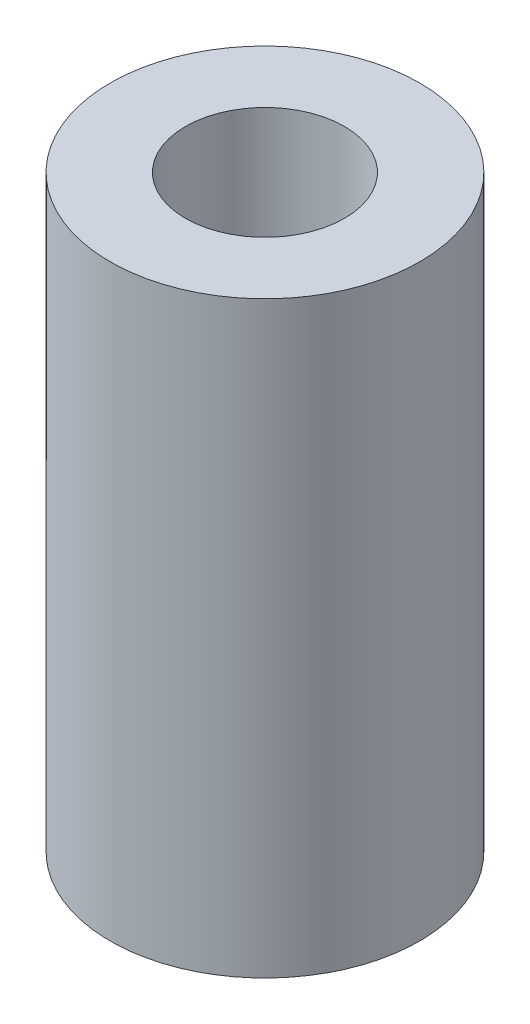
ISO-10303-21;
HEADER;
FILE_DESCRIPTION(('STEP AP214'),'2;1');
FILE_NAME('part.step','',(''),(''),'','','');
FILE_SCHEMA(('AUTOMOTIVE_DESIGN { 1 0 10303 214 1 1 1 1 }'));
ENDSEC;
DATA;
#1=APPLICATION_CONTEXT('core data for automotive mechanical design processes');
#2=APPLICATION_PROTOCOL_DEFINITION('international standard','automotive_design',2000,#1);
#3=PRODUCT_CONTEXT('',#1,'mechanical');
#4=PRODUCT('Part','Part','',(#3));
#5=PRODUCT_RELATED_PRODUCT_CATEGORY('part','',(#4));
#6=PRODUCT_DEFINITION_FORMATION('','',#4);
#7=PRODUCT_DEFINITION_CONTEXT('part definition',#1,'design');
#8=PRODUCT_DEFINITION('design','',#6,#7);
#9=PRODUCT_DEFINITION_SHAPE('','',#8);
#10=(LENGTH_UNIT() NAMED_UNIT(*) SI_UNIT(.MILLI.,.METRE.));
#11=(NAMED_UNIT(*) PLANE_ANGLE_UNIT() SI_UNIT($,.RADIAN.));
#12=(NAMED_UNIT(*) SI_UNIT($,.STERADIAN.) SOLID_ANGLE_UNIT());
#13=UNCERTAINTY_MEASURE_WITH_UNIT(LENGTH_MEASURE(1.E-05),#10,'distance_accuracy_value','');
#14=(GEOMETRIC_REPRESENTATION_CONTEXT(3) GLOBAL_UNCERTAINTY_ASSIGNED_CONTEXT((#13)) GLOBAL_UNIT_ASSIGNED_CONTEXT((#10,
#11,#12)) REPRESENTATION_CONTEXT('',''));
#15=CARTESIAN_POINT('',(0.,0.,0.));
#16=DIRECTION('',(0.,0.,1.));
#17=DIRECTION('',(1.,0.,0.));
#18=AXIS2_PLACEMENT_3D('',#15,#16,#17);
#19=CARTESIAN_POINT('',(0.,24.13,0.));
#20=DIRECTION('',(0.,1.,0.));
#21=DIRECTION('',(0.,0.,1.));
#22=AXIS2_PLACEMENT_3D('',#19,#20,#21);
#23=PLANE('',#22);
#24=CARTESIAN_POINT('',(0.,24.13,0.));
#25=DIRECTION('',(0.,1.,0.));
#26=DIRECTION('',(0.,0.,1.));
#27=AXIS2_PLACEMENT_3D('',#24,#25,#26);
#28=CIRCLE('',#27,6.35);
#29=CARTESIAN_POINT('',(0.,24.13,-6.35));
#30=VERTEX_POINT('',#29);
#31=EDGE_CURVE('E10',#30,#30,#28,.T.);
#32=ORIENTED_EDGE('',*,*,#31,.T.);
#33=EDGE_LOOP('',(#32));
#34=FACE_BOUND('',#33,.T.);
#35=CARTESIAN_POINT('',(0.,24.13,0.));
#36=DIRECTION('',(0.,1.,0.));
#37=DIRECTION('',(0.,0.,1.));
#38=AXIS2_PLACEMENT_3D('',#35,#36,#37);
#39=CIRCLE('',#38,3.2639);
#40=CARTESIAN_POINT('',(0.,24.13,-3.2639));
#41=VERTEX_POINT('',#40);
#42=EDGE_CURVE('E43',#41,#41,#39,.T.);
#43=ORIENTED_EDGE('',*,*,#42,.F.);
#44=EDGE_LOOP('',(#43));
#45=FACE_BOUND('',#44,.T.);
#46=ADVANCED_FACE('F32',(#34,#45),#23,.T.);
#47=CARTESIAN_POINT('',(0.,0.,0.));
#48=DIRECTION('',(0.,1.,0.));
#49=DIRECTION('',(0.,0.,1.));
#50=AXIS2_PLACEMENT_3D('',#47,#48,#49);
#51=PLANE('',#50);
#52=CARTESIAN_POINT('',(0.,0.,0.));
#53=DIRECTION('',(0.,1.,0.));
#54=DIRECTION('',(0.,0.,1.));
#55=AXIS2_PLACEMENT_3D('',#52,#53,#54);
#56=CIRCLE('',#55,6.35);
#57=CARTESIAN_POINT('',(0.,0.,-6.35));
#58=VERTEX_POINT('',#57);
#59=EDGE_CURVE('E36',#58,#58,#56,.T.);
#60=ORIENTED_EDGE('',*,*,#59,.F.);
#61=EDGE_LOOP('',(#60));
#62=FACE_BOUND('',#61,.T.);
#63=CARTESIAN_POINT('',(0.,0.,0.));
#64=DIRECTION('',(0.,1.,0.));
#65=DIRECTION('',(0.,0.,1.));
#66=AXIS2_PLACEMENT_3D('',#63,#64,#65);
#67=CIRCLE('',#66,3.2639);
#68=CARTESIAN_POINT('',(0.,0.,-3.2639));
#69=VERTEX_POINT('',#68);
#70=EDGE_CURVE('E45',#69,#69,#67,.T.);
#71=ORIENTED_EDGE('',*,*,#70,.T.);
#72=EDGE_LOOP('',(#71));
#73=FACE_BOUND('',#72,.T.);
#74=ADVANCED_FACE('F55',(#62,#73),#51,.F.);
#75=CARTESIAN_POINT('',(0.,24.13,0.));
#76=DIRECTION('',(0.,-1.,0.));
#77=DIRECTION('',(0.,0.,-1.));
#78=AXIS2_PLACEMENT_3D('',#75,#76,#77);
#79=CYLINDRICAL_SURFACE('',#78,6.35);
#80=CARTESIAN_POINT('',(0.,24.13,-6.35));
#81=CARTESIAN_POINT('',(0.,23.8786458333333,-6.35));
#82=CARTESIAN_POINT('',(0.,23.6272916666667,-6.35));
#83=CARTESIAN_POINT('',(0.,23.1245833333333,-6.35));
#84=CARTESIAN_POINT('',(0.,22.8732291666667,-6.35));
#85=CARTESIAN_POINT('',(0.,22.3705208333333,-6.35));
#86=CARTESIAN_POINT('',(0.,22.1191666666667,-6.35));
#87=CARTESIAN_POINT('',(0.,21.6164583333333,-6.35));
#88=CARTESIAN_POINT('',(0.,21.3651041666667,-6.35));
#89=CARTESIAN_POINT('',(0.,20.8623958333333,-6.35));
#90=CARTESIAN_POINT('',(0.,20.6110416666667,-6.35));
#91=CARTESIAN_POINT('',(0.,20.1083333333333,-6.35));
#92=CARTESIAN_POINT('',(0.,19.8569791666667,-6.35));
#93=CARTESIAN_POINT('',(0.,19.3542708333333,-6.35));
#94=CARTESIAN_POINT('',(0.,19.1029166666667,-6.35));
#95=CARTESIAN_POINT('',(0.,18.6002083333333,-6.35));
#96=CARTESIAN_POINT('',(0.,18.3488541666667,-6.35));
#97=CARTESIAN_POINT('',(0.,17.8461458333333,-6.35));
#98=CARTESIAN_POINT('',(0.,17.5947916666667,-6.35));
#99=CARTESIAN_POINT('',(0.,17.0920833333333,-6.35));
#100=CARTESIAN_POINT('',(0.,16.8407291666667,-6.35));
#101=CARTESIAN_POINT('',(0.,16.3380208333333,-6.35));
#102=CARTESIAN_POINT('',(0.,16.0866666666667,-6.35));
#103=CARTESIAN_POINT('',(0.,15.5839583333333,-6.35));
#104=CARTESIAN_POINT('',(0.,15.3326041666667,-6.35));
#105=CARTESIAN_POINT('',(0.,14.8298958333333,-6.35));
#106=CARTESIAN_POINT('',(0.,14.5785416666667,-6.35));
#107=CARTESIAN_POINT('',(0.,14.0758333333333,-6.35));
#108=CARTESIAN_POINT('',(0.,13.8244791666667,-6.35));
#109=CARTESIAN_POINT('',(0.,13.3217708333333,-6.35));
#110=CARTESIAN_POINT('',(0.,13.0704166666667,-6.35));
#111=CARTESIAN_POINT('',(0.,12.5677083333333,-6.35));
#112=CARTESIAN_POINT('',(0.,12.3163541666667,-6.35));
#113=CARTESIAN_POINT('',(0.,11.8136458333333,-6.35));
#114=CARTESIAN_POINT('',(0.,11.5622916666667,-6.35));
#115=CARTESIAN_POINT('',(0.,11.0595833333333,-6.35));
#116=CARTESIAN_POINT('',(0.,10.8082291666667,-6.35));
#117=CARTESIAN_POINT('',(0.,10.3055208333333,-6.35));
#118=CARTESIAN_POINT('',(0.,10.0541666666667,-6.35));
#119=CARTESIAN_POINT('',(0.,9.55145833333333,-6.35));
#120=CARTESIAN_POINT('',(0.,9.30010416666667,-6.35));
#121=CARTESIAN_POINT('',(0.,8.79739583333333,-6.35));
#122=CARTESIAN_POINT('',(0.,8.54604166666667,-6.35));
#123=CARTESIAN_POINT('',(0.,8.04333333333333,-6.35));
#124=CARTESIAN_POINT('',(0.,7.79197916666666,-6.35));
#125=CARTESIAN_POINT('',(0.,7.28927083333333,-6.35));
#126=CARTESIAN_POINT('',(0.,7.03791666666666,-6.35));
#127=CARTESIAN_POINT('',(0.,6.53520833333333,-6.35));
#128=CARTESIAN_POINT('',(0.,6.28385416666666,-6.35));
#129=CARTESIAN_POINT('',(0.,5.78114583333333,-6.35));
#130=CARTESIAN_POINT('',(0.,5.52979166666666,-6.35));
#131=CARTESIAN_POINT('',(0.,5.02708333333333,-6.35));
#132=CARTESIAN_POINT('',(0.,4.77572916666666,-6.35));
#133=CARTESIAN_POINT('',(0.,4.27302083333333,-6.35));
#134=CARTESIAN_POINT('',(0.,4.02166666666666,-6.35));
#135=CARTESIAN_POINT('',(0.,3.51895833333333,-6.35));
#136=CARTESIAN_POINT('',(0.,3.26760416666666,-6.35));
#137=CARTESIAN_POINT('',(0.,2.76489583333333,-6.35));
#138=CARTESIAN_POINT('',(0.,2.51354166666666,-6.35));
#139=CARTESIAN_POINT('',(0.,2.01083333333333,-6.35));
#140=CARTESIAN_POINT('',(0.,1.75947916666666,-6.35));
#141=CARTESIAN_POINT('',(0.,1.25677083333333,-6.35));
#142=CARTESIAN_POINT('',(0.,1.00541666666666,-6.35));
#143=CARTESIAN_POINT('',(0.,0.50270833333333,-6.35));
#144=CARTESIAN_POINT('',(0.,0.251354166666663,-6.35));
#145=CARTESIAN_POINT('',(0.,0.,-6.35));
#146=B_SPLINE_CURVE_WITH_KNOTS('',3,(#80,#81,#82,#83,#84,#85,#86,#87,#88,#89,#90,#91,#92,#93,
#94,#95,#96,#97,#98,#99,#100,#101,#102,#103,#104,#105,#106,#107,#108,#109,#110,#111,#112,#113,
#114,#115,#116,#117,#118,#119,#120,#121,#122,#123,#124,#125,#126,#127,#128,#129,#130,#131,#132,
#133,#134,#135,#136,#137,#138,#139,#140,#141,#142,#143,#144,#145),.UNSPECIFIED.,.F.,.F.,(4,2,2,
2,2,2,2,2,2,2,2,2,2,2,2,2,2,2,2,2,2,2,2,2,2,2,2,2,2,2,2,2,4),(0.,0.7540625,1.508125,2.2621875,
3.01625,3.7703125,4.524375,5.2784375,6.0325,6.7865625,7.540625,8.2946875,9.04875,9.8028125,
10.556875,11.3109375,12.065,12.8190625,13.573125,14.3271875,15.08125,15.8353125,16.589375,
17.3434375,18.0975,18.8515625,19.605625,20.3596875,21.11375,21.8678125,22.621875,23.3759375,
24.13),.UNSPECIFIED.);
#147=EDGE_CURVE('BSEAM34',#30,#58,#146,.T.);
#148=ORIENTED_EDGE('',*,*,#31,.F.);
#149=ORIENTED_EDGE('',*,*,#59,.T.);
#150=ORIENTED_EDGE('',*,*,#147,.T.);
#151=ORIENTED_EDGE('',*,*,#147,.F.);
#152=EDGE_LOOP('',(#148,#150,#149,#151));
#153=FACE_BOUND('',#152,.T.);
#154=ADVANCED_FACE('F34',(#153),#79,.T.);
#155=CARTESIAN_POINT('',(0.,24.13,0.));
#156=DIRECTION('',(0.,-1.,0.));
#157=DIRECTION('',(0.,0.,-1.));
#158=AXIS2_PLACEMENT_3D('',#155,#156,#157);
#159=CYLINDRICAL_SURFACE('',#158,3.2639);
#160=CARTESIAN_POINT('',(0.,24.13,-3.2639));
#161=CARTESIAN_POINT('',(0.,23.8786458333333,-3.2639));
#162=CARTESIAN_POINT('',(0.,23.6272916666667,-3.2639));
#163=CARTESIAN_POINT('',(0.,23.1245833333333,-3.2639));
#164=CARTESIAN_POINT('',(0.,22.8732291666667,-3.2639));
#165=CARTESIAN_POINT('',(0.,22.3705208333333,-3.2639));
#166=CARTESIAN_POINT('',(0.,22.1191666666667,-3.2639));
#167=CARTESIAN_POINT('',(0.,21.6164583333333,-3.2639));
#168=CARTESIAN_POINT('',(0.,21.3651041666667,-3.2639));
#169=CARTESIAN_POINT('',(0.,20.8623958333333,-3.2639));
#170=CARTESIAN_POINT('',(0.,20.6110416666667,-3.2639));
#171=CARTESIAN_POINT('',(0.,20.1083333333333,-3.2639));
#172=CARTESIAN_POINT('',(0.,19.8569791666667,-3.2639));
#173=CARTESIAN_POINT('',(0.,19.3542708333333,-3.2639));
#174=CARTESIAN_POINT('',(0.,19.1029166666667,-3.2639));
#175=CARTESIAN_POINT('',(0.,18.6002083333333,-3.2639));
#176=CARTESIAN_POINT('',(0.,18.3488541666667,-3.2639));
#177=CARTESIAN_POINT('',(0.,17.8461458333333,-3.2639));
#178=CARTESIAN_POINT('',(0.,17.5947916666667,-3.2639));
#179=CARTESIAN_POINT('',(0.,17.0920833333333,-3.2639));
#180=CARTESIAN_POINT('',(0.,16.8407291666667,-3.2639));
#181=CARTESIAN_POINT('',(0.,16.3380208333333,-3.2639));
#182=CARTESIAN_POINT('',(0.,16.0866666666667,-3.2639));
#183=CARTESIAN_POINT('',(0.,15.5839583333333,-3.2639));
#184=CARTESIAN_POINT('',(0.,15.3326041666667,-3.2639));
#185=CARTESIAN_POINT('',(0.,14.8298958333333,-3.2639));
#186=CARTESIAN_POINT('',(0.,14.5785416666667,-3.2639));
#187=CARTESIAN_POINT('',(0.,14.0758333333333,-3.2639));
#188=CARTESIAN_POINT('',(0.,13.8244791666667,-3.2639));
#189=CARTESIAN_POINT('',(0.,13.3217708333333,-3.2639));
#190=CARTESIAN_POINT('',(0.,13.0704166666667,-3.2639));
#191=CARTESIAN_POINT('',(0.,12.5677083333333,-3.2639));
#192=CARTESIAN_POINT('',(0.,12.3163541666667,-3.2639));
#193=CARTESIAN_POINT('',(0.,11.8136458333333,-3.2639));
#194=CARTESIAN_POINT('',(0.,11.5622916666667,-3.2639));
#195=CARTESIAN_POINT('',(0.,11.0595833333333,-3.2639));
#196=CARTESIAN_POINT('',(0.,10.8082291666667,-3.2639));
#197=CARTESIAN_POINT('',(0.,10.3055208333333,-3.2639));
#198=CARTESIAN_POINT('',(0.,10.0541666666667,-3.2639));
#199=CARTESIAN_POINT('',(0.,9.55145833333333,-3.2639));
#200=CARTESIAN_POINT('',(0.,9.30010416666666,-3.2639));
#201=CARTESIAN_POINT('',(0.,8.79739583333333,-3.2639));
#202=CARTESIAN_POINT('',(0.,8.54604166666666,-3.2639));
#203=CARTESIAN_POINT('',(0.,8.04333333333333,-3.2639));
#204=CARTESIAN_POINT('',(0.,7.79197916666666,-3.2639));
#205=CARTESIAN_POINT('',(0.,7.28927083333333,-3.2639));
#206=CARTESIAN_POINT('',(0.,7.03791666666667,-3.2639));
#207=CARTESIAN_POINT('',(0.,6.53520833333333,-3.2639));
#208=CARTESIAN_POINT('',(0.,6.28385416666667,-3.2639));
#209=CARTESIAN_POINT('',(0.,5.78114583333333,-3.2639));
#210=CARTESIAN_POINT('',(0.,5.52979166666666,-3.2639));
#211=CARTESIAN_POINT('',(0.,5.02708333333333,-3.2639));
#212=CARTESIAN_POINT('',(0.,4.77572916666666,-3.2639));
#213=CARTESIAN_POINT('',(0.,4.27302083333333,-3.2639));
#214=CARTESIAN_POINT('',(0.,4.02166666666666,-3.2639));
#215=CARTESIAN_POINT('',(0.,3.51895833333333,-3.2639));
#216=CARTESIAN_POINT('',(0.,3.26760416666666,-3.2639));
#217=CARTESIAN_POINT('',(0.,2.76489583333333,-3.2639));
#218=CARTESIAN_POINT('',(0.,2.51354166666667,-3.2639));
#219=CARTESIAN_POINT('',(0.,2.01083333333333,-3.2639));
#220=CARTESIAN_POINT('',(0.,1.75947916666666,-3.2639));
#221=CARTESIAN_POINT('',(0.,1.25677083333333,-3.2639));
#222=CARTESIAN_POINT('',(0.,1.00541666666666,-3.2639));
#223=CARTESIAN_POINT('',(0.,0.50270833333333,-3.2639));
#224=CARTESIAN_POINT('',(0.,0.251354166666663,-3.2639));
#225=CARTESIAN_POINT('',(0.,0.,-3.2639));
#226=B_SPLINE_CURVE_WITH_KNOTS('',3,(#160,#161,#162,#163,#164,#165,#166,#167,#168,#169,#170,
#171,#172,#173,#174,#175,#176,#177,#178,#179,#180,#181,#182,#183,#184,#185,#186,#187,#188,#189,
#190,#191,#192,#193,#194,#195,#196,#197,#198,#199,#200,#201,#202,#203,#204,#205,#206,#207,#208,
#209,#210,#211,#212,#213,#214,#215,#216,#217,#218,#219,#220,#221,#222,#223,#224,#225),
.UNSPECIFIED.,.F.,.F.,(4,2,2,2,2,2,2,2,2,2,2,2,2,2,2,2,2,2,2,2,2,2,2,2,2,2,2,2,2,2,2,2,4),(0.,
0.754062500000003,1.508125,2.2621875,3.01625,3.7703125,4.524375,5.2784375,6.0325,6.7865625,
7.540625,8.2946875,9.04875,9.8028125,10.556875,11.3109375,12.065,12.8190625,13.573125,
14.3271875,15.08125,15.8353125,16.589375,17.3434375,18.0975,18.8515625,19.605625,20.3596875,
21.11375,21.8678125,22.621875,23.3759375,24.13),.UNSPECIFIED.);
#227=EDGE_CURVE('BSEAM51',#41,#69,#226,.T.);
#228=ORIENTED_EDGE('',*,*,#42,.T.);
#229=ORIENTED_EDGE('',*,*,#70,.F.);
#230=ORIENTED_EDGE('',*,*,#227,.T.);
#231=ORIENTED_EDGE('',*,*,#227,.F.);
#232=EDGE_LOOP('',(#228,#230,#229,#231));
#233=FACE_BOUND('',#232,.T.);
#234=ADVANCED_FACE('F51',(#233),#159,.F.);
#235=CLOSED_SHELL('',(#46,#74,#154,#234));
#236=MANIFOLD_SOLID_BREP('B2',#235);
#237=ADVANCED_BREP_SHAPE_REPRESENTATION('',(#18,#236),#14);
#238=SHAPE_DEFINITION_REPRESENTATION(#9,#237);
ENDSEC;
END-ISO-10303-21;
